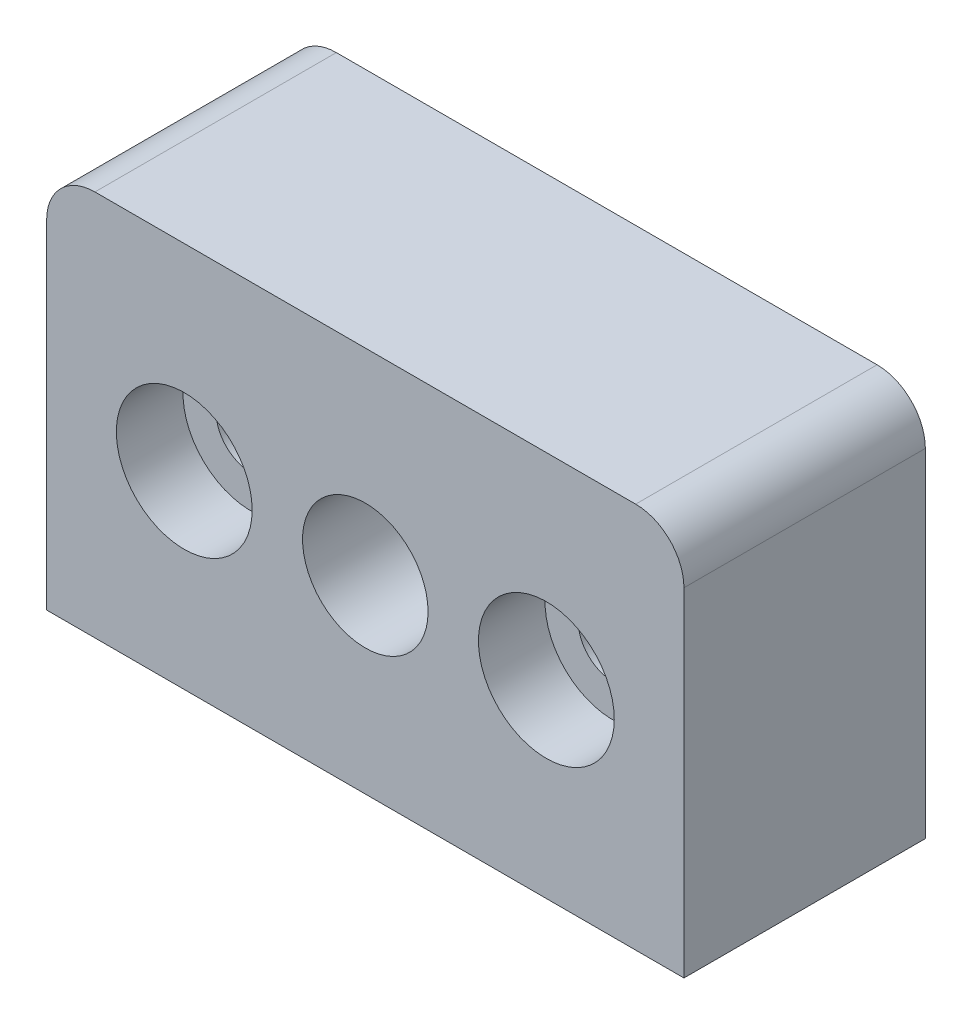
ISO-10303-21;
HEADER;
FILE_DESCRIPTION(('STEP AP214'),'2;1');
FILE_NAME('part.step','',(''),(''),'','','');
FILE_SCHEMA(('AUTOMOTIVE_DESIGN { 1 0 10303 214 1 1 1 1 }'));
ENDSEC;
DATA;
#1=APPLICATION_CONTEXT('core data for automotive mechanical design processes');
#2=APPLICATION_PROTOCOL_DEFINITION('international standard','automotive_design',2000,#1);
#3=PRODUCT_CONTEXT('',#1,'mechanical');
#4=PRODUCT('Part','Part','',(#3));
#5=PRODUCT_RELATED_PRODUCT_CATEGORY('part','',(#4));
#6=PRODUCT_DEFINITION_FORMATION('','',#4);
#7=PRODUCT_DEFINITION_CONTEXT('part definition',#1,'design');
#8=PRODUCT_DEFINITION('design','',#6,#7);
#9=PRODUCT_DEFINITION_SHAPE('','',#8);
#10=(LENGTH_UNIT() NAMED_UNIT(*) SI_UNIT(.MILLI.,.METRE.));
#11=(NAMED_UNIT(*) PLANE_ANGLE_UNIT() SI_UNIT($,.RADIAN.));
#12=(NAMED_UNIT(*) SI_UNIT($,.STERADIAN.) SOLID_ANGLE_UNIT());
#13=UNCERTAINTY_MEASURE_WITH_UNIT(LENGTH_MEASURE(1.E-05),#10,'distance_accuracy_value','');
#14=(GEOMETRIC_REPRESENTATION_CONTEXT(3) GLOBAL_UNCERTAINTY_ASSIGNED_CONTEXT((#13)) GLOBAL_UNIT_ASSIGNED_CONTEXT((#10,
#11,#12)) REPRESENTATION_CONTEXT('',''));
#15=CARTESIAN_POINT('',(0.,0.,0.));
#16=DIRECTION('',(0.,0.,1.));
#17=DIRECTION('',(1.,0.,0.));
#18=AXIS2_PLACEMENT_3D('',#15,#16,#17);
#19=CARTESIAN_POINT('',(0.,0.,12.7));
#20=DIRECTION('',(1.,0.,0.));
#21=DIRECTION('',(0.,1.,0.));
#22=AXIS2_PLACEMENT_3D('',#19,#20,#21);
#23=PLANE('',#22);
#24=DIRECTION('',(0.,-1.,0.));
#25=VECTOR('',#24,1.);
#26=CARTESIAN_POINT('',(0.,0.,12.7));
#27=LINE('',#26,#25);
#28=CARTESIAN_POINT('',(0.,17.78,12.7));
#29=VERTEX_POINT('',#28);
#30=CARTESIAN_POINT('',(0.,0.,12.7));
#31=VERTEX_POINT('',#30);
#32=EDGE_CURVE('E145',#29,#31,#27,.T.);
#33=ORIENTED_EDGE('',*,*,#32,.F.);
#34=DIRECTION('',(0.,0.,-1.));
#35=VECTOR('',#34,1.);
#36=CARTESIAN_POINT('',(0.,17.78,12.7));
#37=LINE('',#36,#35);
#38=CARTESIAN_POINT('',(0.,17.78,0.));
#39=VERTEX_POINT('',#38);
#40=EDGE_CURVE('E166',#29,#39,#37,.T.);
#41=ORIENTED_EDGE('',*,*,#40,.T.);
#42=DIRECTION('',(0.,-1.,0.));
#43=VECTOR('',#42,1.);
#44=CARTESIAN_POINT('',(0.,0.,0.));
#45=LINE('',#44,#43);
#46=CARTESIAN_POINT('',(0.,0.,0.));
#47=VERTEX_POINT('',#46);
#48=EDGE_CURVE('E142',#39,#47,#45,.T.);
#49=ORIENTED_EDGE('',*,*,#48,.T.);
#50=DIRECTION('',(0.,0.,-1.));
#51=VECTOR('',#50,1.);
#52=CARTESIAN_POINT('',(0.,0.,12.7));
#53=LINE('',#52,#51);
#54=EDGE_CURVE('E163',#31,#47,#53,.T.);
#55=ORIENTED_EDGE('',*,*,#54,.F.);
#56=EDGE_LOOP('',(#33,#41,#49,#55));
#57=FACE_BOUND('',#56,.T.);
#58=ADVANCED_FACE('F34',(#57),#23,.F.);
#59=CARTESIAN_POINT('',(0.,0.,12.7));
#60=DIRECTION('',(0.,1.,0.));
#61=DIRECTION('',(0.,0.,1.));
#62=AXIS2_PLACEMENT_3D('',#59,#60,#61);
#63=PLANE('',#62);
#64=CARTESIAN_POINT('',(11.43,0.,6.35));
#65=DIRECTION('',(0.,-1.,0.));
#66=DIRECTION('',(0.,0.,-1.));
#67=AXIS2_PLACEMENT_3D('',#64,#65,#66);
#68=CIRCLE('',#67,1.35254999999999);
#69=CARTESIAN_POINT('',(11.43,0.,4.99745000000001));
#70=VERTEX_POINT('',#69);
#71=EDGE_CURVE('E104',#70,#70,#68,.T.);
#72=ORIENTED_EDGE('',*,*,#71,.F.);
#73=EDGE_LOOP('',(#72));
#74=FACE_BOUND('',#73,.T.);
#75=CARTESIAN_POINT('',(22.098,0.,6.35));
#76=DIRECTION('',(0.,-1.,0.));
#77=DIRECTION('',(0.,0.,-1.));
#78=AXIS2_PLACEMENT_3D('',#75,#76,#77);
#79=CIRCLE('',#78,1.35254999999999);
#80=CARTESIAN_POINT('',(22.098,0.,4.99745000000001));
#81=VERTEX_POINT('',#80);
#82=EDGE_CURVE('E103',#81,#81,#79,.T.);
#83=ORIENTED_EDGE('',*,*,#82,.F.);
#84=EDGE_LOOP('',(#83));
#85=FACE_BOUND('',#84,.T.);
#86=DIRECTION('',(1.,0.,0.));
#87=VECTOR('',#86,1.);
#88=CARTESIAN_POINT('',(0.,0.,0.));
#89=LINE('',#88,#87);
#90=CARTESIAN_POINT('',(33.528,0.,0.));
#91=VERTEX_POINT('',#90);
#92=EDGE_CURVE('E156',#47,#91,#89,.T.);
#93=ORIENTED_EDGE('',*,*,#92,.T.);
#94=DIRECTION('',(0.,0.,-1.));
#95=VECTOR('',#94,1.);
#96=CARTESIAN_POINT('',(33.528,0.,12.7));
#97=LINE('',#96,#95);
#98=CARTESIAN_POINT('',(33.528,0.,12.7));
#99=VERTEX_POINT('',#98);
#100=EDGE_CURVE('E154',#99,#91,#97,.T.);
#101=ORIENTED_EDGE('',*,*,#100,.F.);
#102=DIRECTION('',(1.,0.,0.));
#103=VECTOR('',#102,1.);
#104=CARTESIAN_POINT('',(0.,0.,12.7));
#105=LINE('',#104,#103);
#106=EDGE_CURVE('E147',#31,#99,#105,.T.);
#107=ORIENTED_EDGE('',*,*,#106,.F.);
#108=ORIENTED_EDGE('',*,*,#54,.T.);
#109=EDGE_LOOP('',(#93,#101,#107,#108));
#110=FACE_BOUND('',#109,.T.);
#111=ADVANCED_FACE('F201',(#74,#85,#110),#63,.F.);
#112=CARTESIAN_POINT('',(33.528,0.,12.7));
#113=DIRECTION('',(-1.,0.,0.));
#114=DIRECTION('',(0.,-1.,0.));
#115=AXIS2_PLACEMENT_3D('',#112,#113,#114);
#116=PLANE('',#115);
#117=DIRECTION('',(0.,1.,0.));
#118=VECTOR('',#117,1.);
#119=CARTESIAN_POINT('',(33.528,0.,0.));
#120=LINE('',#119,#118);
#121=CARTESIAN_POINT('',(33.528,17.78,0.));
#122=VERTEX_POINT('',#121);
#123=EDGE_CURVE('E158',#91,#122,#120,.T.);
#124=ORIENTED_EDGE('',*,*,#123,.T.);
#125=DIRECTION('',(0.,0.,-1.));
#126=VECTOR('',#125,1.);
#127=CARTESIAN_POINT('',(33.528,17.78,12.7));
#128=LINE('',#127,#126);
#129=CARTESIAN_POINT('',(33.528,17.78,12.7));
#130=VERTEX_POINT('',#129);
#131=EDGE_CURVE('E11',#122,#130,#128,.F.);
#132=ORIENTED_EDGE('',*,*,#131,.T.);
#133=DIRECTION('',(0.,1.,0.));
#134=VECTOR('',#133,1.);
#135=CARTESIAN_POINT('',(33.528,0.,12.7));
#136=LINE('',#135,#134);
#137=EDGE_CURVE('E150',#99,#130,#136,.T.);
#138=ORIENTED_EDGE('',*,*,#137,.F.);
#139=ORIENTED_EDGE('',*,*,#100,.T.);
#140=EDGE_LOOP('',(#124,#132,#138,#139));
#141=FACE_BOUND('',#140,.T.);
#142=ADVANCED_FACE('F198',(#141),#116,.F.);
#143=CARTESIAN_POINT('',(0.,20.32,12.7));
#144=DIRECTION('',(0.,-1.,0.));
#145=DIRECTION('',(0.,0.,-1.));
#146=AXIS2_PLACEMENT_3D('',#143,#144,#145);
#147=PLANE('',#146);
#148=DIRECTION('',(-1.,0.,0.));
#149=VECTOR('',#148,1.);
#150=CARTESIAN_POINT('',(0.,20.32,0.));
#151=LINE('',#150,#149);
#152=CARTESIAN_POINT('',(30.988,20.32,0.));
#153=VERTEX_POINT('',#152);
#154=CARTESIAN_POINT('',(2.53999999999999,20.32,0.));
#155=VERTEX_POINT('',#154);
#156=EDGE_CURVE('E148',#153,#155,#151,.T.);
#157=ORIENTED_EDGE('',*,*,#156,.T.);
#158=DIRECTION('',(0.,0.,-1.));
#159=VECTOR('',#158,1.);
#160=CARTESIAN_POINT('',(2.53999999999999,20.32,12.7));
#161=LINE('',#160,#159);
#162=CARTESIAN_POINT('',(2.53999999999999,20.32,12.7));
#163=VERTEX_POINT('',#162);
#164=EDGE_CURVE('E55',#155,#163,#161,.F.);
#165=ORIENTED_EDGE('',*,*,#164,.T.);
#166=DIRECTION('',(-1.,0.,0.));
#167=VECTOR('',#166,1.);
#168=CARTESIAN_POINT('',(0.,20.32,12.7));
#169=LINE('',#168,#167);
#170=CARTESIAN_POINT('',(30.988,20.32,12.7));
#171=VERTEX_POINT('',#170);
#172=EDGE_CURVE('E152',#171,#163,#169,.T.);
#173=ORIENTED_EDGE('',*,*,#172,.F.);
#174=DIRECTION('',(0.,0.,-1.));
#175=VECTOR('',#174,1.);
#176=CARTESIAN_POINT('',(30.988,20.32,12.7));
#177=LINE('',#176,#175);
#178=EDGE_CURVE('E173',#171,#153,#177,.T.);
#179=ORIENTED_EDGE('',*,*,#178,.T.);
#180=EDGE_LOOP('',(#157,#165,#173,#179));
#181=FACE_BOUND('',#180,.T.);
#182=ADVANCED_FACE('F193',(#181),#147,.F.);
#183=CARTESIAN_POINT('',(0.,0.,12.7));
#184=DIRECTION('',(0.,0.,-1.));
#185=DIRECTION('',(-1.,0.,0.));
#186=AXIS2_PLACEMENT_3D('',#183,#184,#185);
#187=PLANE('',#186);
#188=CARTESIAN_POINT('',(7.23899999999999,9.9568,12.7));
#189=DIRECTION('',(0.,0.,1.));
#190=DIRECTION('',(1.,0.,0.));
#191=AXIS2_PLACEMENT_3D('',#188,#189,#190);
#192=CIRCLE('',#191,3.57251);
#193=CARTESIAN_POINT('',(10.81151,9.9568,12.7));
#194=VERTEX_POINT('',#193);
#195=EDGE_CURVE('E114',#194,#194,#192,.T.);
#196=ORIENTED_EDGE('',*,*,#195,.F.);
#197=EDGE_LOOP('',(#196));
#198=FACE_BOUND('',#197,.T.);
#199=CARTESIAN_POINT('',(26.289,9.9568,12.7));
#200=DIRECTION('',(0.,0.,1.));
#201=DIRECTION('',(1.,0.,0.));
#202=AXIS2_PLACEMENT_3D('',#199,#200,#201);
#203=CIRCLE('',#202,3.57251);
#204=CARTESIAN_POINT('',(29.86151,9.9568,12.7));
#205=VERTEX_POINT('',#204);
#206=EDGE_CURVE('E126',#205,#205,#203,.T.);
#207=ORIENTED_EDGE('',*,*,#206,.F.);
#208=EDGE_LOOP('',(#207));
#209=FACE_BOUND('',#208,.T.);
#210=CARTESIAN_POINT('',(16.764,9.9568,12.7));
#211=DIRECTION('',(0.,0.,1.));
#212=DIRECTION('',(1.,0.,0.));
#213=AXIS2_PLACEMENT_3D('',#210,#211,#212);
#214=CIRCLE('',#213,3.302);
#215=CARTESIAN_POINT('',(20.066,9.9568,12.7));
#216=VERTEX_POINT('',#215);
#217=EDGE_CURVE('E138',#216,#216,#214,.T.);
#218=ORIENTED_EDGE('',*,*,#217,.F.);
#219=EDGE_LOOP('',(#218));
#220=FACE_BOUND('',#219,.T.);
#221=ORIENTED_EDGE('',*,*,#172,.T.);
#222=CARTESIAN_POINT('',(2.53999999999999,17.78,12.7));
#223=DIRECTION('',(0.,0.,-1.));
#224=DIRECTION('',(-1.,0.,0.));
#225=AXIS2_PLACEMENT_3D('',#222,#223,#224);
#226=CIRCLE('',#225,2.54);
#227=EDGE_CURVE('E42',#163,#29,#226,.F.);
#228=ORIENTED_EDGE('',*,*,#227,.T.);
#229=ORIENTED_EDGE('',*,*,#32,.T.);
#230=ORIENTED_EDGE('',*,*,#106,.T.);
#231=ORIENTED_EDGE('',*,*,#137,.T.);
#232=CARTESIAN_POINT('',(30.988,17.78,12.7));
#233=DIRECTION('',(0.,0.,-1.));
#234=DIRECTION('',(-1.,0.,0.));
#235=AXIS2_PLACEMENT_3D('',#232,#233,#234);
#236=CIRCLE('',#235,2.54);
#237=EDGE_CURVE('E177',#130,#171,#236,.F.);
#238=ORIENTED_EDGE('',*,*,#237,.T.);
#239=EDGE_LOOP('',(#221,#228,#229,#230,#231,#238));
#240=FACE_BOUND('',#239,.T.);
#241=ADVANCED_FACE('F181',(#198,#209,#220,#240),#187,.F.);
#242=CARTESIAN_POINT('',(0.,0.,0.));
#243=DIRECTION('',(0.,0.,-1.));
#244=DIRECTION('',(-1.,0.,0.));
#245=AXIS2_PLACEMENT_3D('',#242,#243,#244);
#246=PLANE('',#245);
#247=CARTESIAN_POINT('',(7.23899999999999,9.9568,0.));
#248=DIRECTION('',(0.,0.,1.));
#249=DIRECTION('',(1.,0.,0.));
#250=AXIS2_PLACEMENT_3D('',#247,#248,#249);
#251=CIRCLE('',#250,1.8288);
#252=CARTESIAN_POINT('',(9.06779999999999,9.9568,0.));
#253=VERTEX_POINT('',#252);
#254=EDGE_CURVE('E123',#253,#253,#251,.T.);
#255=ORIENTED_EDGE('',*,*,#254,.T.);
#256=EDGE_LOOP('',(#255));
#257=FACE_BOUND('',#256,.T.);
#258=CARTESIAN_POINT('',(26.289,9.9568,0.));
#259=DIRECTION('',(0.,0.,1.));
#260=DIRECTION('',(1.,0.,0.));
#261=AXIS2_PLACEMENT_3D('',#258,#259,#260);
#262=CIRCLE('',#261,1.8288);
#263=CARTESIAN_POINT('',(28.1178,9.9568,0.));
#264=VERTEX_POINT('',#263);
#265=EDGE_CURVE('E135',#264,#264,#262,.T.);
#266=ORIENTED_EDGE('',*,*,#265,.T.);
#267=EDGE_LOOP('',(#266));
#268=FACE_BOUND('',#267,.T.);
#269=CARTESIAN_POINT('',(16.764,9.9568,0.));
#270=DIRECTION('',(0.,0.,1.));
#271=DIRECTION('',(1.,0.,0.));
#272=AXIS2_PLACEMENT_3D('',#269,#270,#271);
#273=CIRCLE('',#272,3.302);
#274=CARTESIAN_POINT('',(20.066,9.9568,0.));
#275=VERTEX_POINT('',#274);
#276=EDGE_CURVE('E139',#275,#275,#273,.T.);
#277=ORIENTED_EDGE('',*,*,#276,.T.);
#278=EDGE_LOOP('',(#277));
#279=FACE_BOUND('',#278,.T.);
#280=ORIENTED_EDGE('',*,*,#48,.F.);
#281=CARTESIAN_POINT('',(2.53999999999999,17.78,0.));
#282=DIRECTION('',(0.,0.,-1.));
#283=DIRECTION('',(-1.,0.,0.));
#284=AXIS2_PLACEMENT_3D('',#281,#282,#283);
#285=CIRCLE('',#284,2.54);
#286=EDGE_CURVE('E171',#39,#155,#285,.T.);
#287=ORIENTED_EDGE('',*,*,#286,.T.);
#288=ORIENTED_EDGE('',*,*,#156,.F.);
#289=CARTESIAN_POINT('',(30.988,17.78,0.));
#290=DIRECTION('',(0.,0.,-1.));
#291=DIRECTION('',(-1.,0.,0.));
#292=AXIS2_PLACEMENT_3D('',#289,#290,#291);
#293=CIRCLE('',#292,2.54);
#294=EDGE_CURVE('E169',#153,#122,#293,.T.);
#295=ORIENTED_EDGE('',*,*,#294,.T.);
#296=ORIENTED_EDGE('',*,*,#123,.F.);
#297=ORIENTED_EDGE('',*,*,#92,.F.);
#298=EDGE_LOOP('',(#280,#287,#288,#295,#296,#297));
#299=FACE_BOUND('',#298,.T.);
#300=ADVANCED_FACE('F191',(#257,#268,#279,#299),#246,.T.);
#301=CARTESIAN_POINT('',(16.764,9.9568,0.));
#302=DIRECTION('',(0.,0.,1.));
#303=DIRECTION('',(1.,0.,0.));
#304=AXIS2_PLACEMENT_3D('',#301,#302,#303);
#305=CYLINDRICAL_SURFACE('',#304,3.302);
#306=ORIENTED_EDGE('',*,*,#276,.F.);
#307=EDGE_LOOP('',(#306));
#308=FACE_BOUND('',#307,.T.);
#309=ORIENTED_EDGE('',*,*,#217,.T.);
#310=EDGE_LOOP('',(#309));
#311=FACE_BOUND('',#310,.T.);
#312=ADVANCED_FACE('F250',(#308,#311),#305,.F.);
#313=CARTESIAN_POINT('',(26.289,9.9568,12.7));
#314=DIRECTION('',(0.,0.,1.));
#315=DIRECTION('',(1.,0.,0.));
#316=AXIS2_PLACEMENT_3D('',#313,#314,#315);
#317=CYLINDRICAL_SURFACE('',#316,1.8288);
#318=ORIENTED_EDGE('',*,*,#265,.F.);
#319=EDGE_LOOP('',(#318));
#320=FACE_BOUND('',#319,.T.);
#321=CARTESIAN_POINT('',(26.289,9.9568,9.1948));
#322=DIRECTION('',(0.,0.,1.));
#323=DIRECTION('',(1.,0.,0.));
#324=AXIS2_PLACEMENT_3D('',#321,#322,#323);
#325=CIRCLE('',#324,1.8288);
#326=CARTESIAN_POINT('',(28.1178,9.9568,9.1948));
#327=VERTEX_POINT('',#326);
#328=EDGE_CURVE('E132',#327,#327,#325,.T.);
#329=ORIENTED_EDGE('',*,*,#328,.T.);
#330=EDGE_LOOP('',(#329));
#331=FACE_BOUND('',#330,.T.);
#332=ADVANCED_FACE('F246',(#320,#331),#317,.F.);
#333=CARTESIAN_POINT('',(28.1178,9.9568,9.1948));
#334=DIRECTION('',(0.,0.,-1.));
#335=DIRECTION('',(-1.,0.,0.));
#336=AXIS2_PLACEMENT_3D('',#333,#334,#335);
#337=PLANE('',#336);
#338=ORIENTED_EDGE('',*,*,#328,.F.);
#339=EDGE_LOOP('',(#338));
#340=FACE_BOUND('',#339,.T.);
#341=CARTESIAN_POINT('',(26.289,9.9568,9.1948));
#342=DIRECTION('',(0.,0.,1.));
#343=DIRECTION('',(1.,0.,0.));
#344=AXIS2_PLACEMENT_3D('',#341,#342,#343);
#345=CIRCLE('',#344,3.57251);
#346=CARTESIAN_POINT('',(29.86151,9.9568,9.1948));
#347=VERTEX_POINT('',#346);
#348=EDGE_CURVE('E129',#347,#347,#345,.T.);
#349=ORIENTED_EDGE('',*,*,#348,.T.);
#350=EDGE_LOOP('',(#349));
#351=FACE_BOUND('',#350,.T.);
#352=ADVANCED_FACE('F242',(#340,#351),#337,.F.);
#353=CARTESIAN_POINT('',(26.289,9.9568,12.7));
#354=DIRECTION('',(0.,0.,1.));
#355=DIRECTION('',(1.,0.,0.));
#356=AXIS2_PLACEMENT_3D('',#353,#354,#355);
#357=CYLINDRICAL_SURFACE('',#356,3.57251);
#358=ORIENTED_EDGE('',*,*,#348,.F.);
#359=EDGE_LOOP('',(#358));
#360=FACE_BOUND('',#359,.T.);
#361=ORIENTED_EDGE('',*,*,#206,.T.);
#362=EDGE_LOOP('',(#361));
#363=FACE_BOUND('',#362,.T.);
#364=ADVANCED_FACE('F238',(#360,#363),#357,.F.);
#365=CARTESIAN_POINT('',(7.23899999999999,9.9568,12.7));
#366=DIRECTION('',(0.,0.,1.));
#367=DIRECTION('',(1.,0.,0.));
#368=AXIS2_PLACEMENT_3D('',#365,#366,#367);
#369=CYLINDRICAL_SURFACE('',#368,1.8288);
#370=ORIENTED_EDGE('',*,*,#254,.F.);
#371=EDGE_LOOP('',(#370));
#372=FACE_BOUND('',#371,.T.);
#373=CARTESIAN_POINT('',(7.23899999999999,9.9568,9.1948));
#374=DIRECTION('',(0.,0.,1.));
#375=DIRECTION('',(1.,0.,0.));
#376=AXIS2_PLACEMENT_3D('',#373,#374,#375);
#377=CIRCLE('',#376,1.8288);
#378=CARTESIAN_POINT('',(9.06779999999999,9.9568,9.1948));
#379=VERTEX_POINT('',#378);
#380=EDGE_CURVE('E120',#379,#379,#377,.T.);
#381=ORIENTED_EDGE('',*,*,#380,.T.);
#382=EDGE_LOOP('',(#381));
#383=FACE_BOUND('',#382,.T.);
#384=ADVANCED_FACE('F228',(#372,#383),#369,.F.);
#385=CARTESIAN_POINT('',(9.06779999999999,9.9568,9.1948));
#386=DIRECTION('',(0.,0.,-1.));
#387=DIRECTION('',(-1.,0.,0.));
#388=AXIS2_PLACEMENT_3D('',#385,#386,#387);
#389=PLANE('',#388);
#390=ORIENTED_EDGE('',*,*,#380,.F.);
#391=EDGE_LOOP('',(#390));
#392=FACE_BOUND('',#391,.T.);
#393=CARTESIAN_POINT('',(7.23899999999999,9.9568,9.1948));
#394=DIRECTION('',(0.,0.,1.));
#395=DIRECTION('',(1.,0.,0.));
#396=AXIS2_PLACEMENT_3D('',#393,#394,#395);
#397=CIRCLE('',#396,3.57251);
#398=CARTESIAN_POINT('',(10.81151,9.9568,9.1948));
#399=VERTEX_POINT('',#398);
#400=EDGE_CURVE('E117',#399,#399,#397,.T.);
#401=ORIENTED_EDGE('',*,*,#400,.T.);
#402=EDGE_LOOP('',(#401));
#403=FACE_BOUND('',#402,.T.);
#404=ADVANCED_FACE('F222',(#392,#403),#389,.F.);
#405=CARTESIAN_POINT('',(7.23899999999999,9.9568,12.7));
#406=DIRECTION('',(0.,0.,1.));
#407=DIRECTION('',(1.,0.,0.));
#408=AXIS2_PLACEMENT_3D('',#405,#406,#407);
#409=CYLINDRICAL_SURFACE('',#408,3.57251);
#410=ORIENTED_EDGE('',*,*,#400,.F.);
#411=EDGE_LOOP('',(#410));
#412=FACE_BOUND('',#411,.T.);
#413=ORIENTED_EDGE('',*,*,#195,.T.);
#414=EDGE_LOOP('',(#413));
#415=FACE_BOUND('',#414,.T.);
#416=ADVANCED_FACE('F216',(#412,#415),#409,.F.);
#417=CARTESIAN_POINT('',(2.53999999999999,17.78,12.7));
#418=DIRECTION('',(0.,0.,-1.));
#419=DIRECTION('',(-1.,0.,0.));
#420=AXIS2_PLACEMENT_3D('',#417,#418,#419);
#421=CYLINDRICAL_SURFACE('',#420,2.54);
#422=ORIENTED_EDGE('',*,*,#227,.F.);
#423=ORIENTED_EDGE('',*,*,#164,.F.);
#424=ORIENTED_EDGE('',*,*,#286,.F.);
#425=ORIENTED_EDGE('',*,*,#40,.F.);
#426=EDGE_LOOP('',(#422,#423,#424,#425));
#427=FACE_BOUND('',#426,.T.);
#428=ADVANCED_FACE('F188',(#427),#421,.T.);
#429=CARTESIAN_POINT('',(30.988,17.78,12.7));
#430=DIRECTION('',(0.,0.,-1.));
#431=DIRECTION('',(-1.,0.,0.));
#432=AXIS2_PLACEMENT_3D('',#429,#430,#431);
#433=CYLINDRICAL_SURFACE('',#432,2.54);
#434=ORIENTED_EDGE('',*,*,#237,.F.);
#435=ORIENTED_EDGE('',*,*,#131,.F.);
#436=ORIENTED_EDGE('',*,*,#294,.F.);
#437=ORIENTED_EDGE('',*,*,#178,.F.);
#438=EDGE_LOOP('',(#434,#435,#436,#437));
#439=FACE_BOUND('',#438,.T.);
#440=ADVANCED_FACE('F36',(#439),#433,.T.);
#441=CARTESIAN_POINT('',(22.098,7.62,6.35));
#442=DIRECTION('',(0.,-1.,0.));
#443=DIRECTION('',(0.,0.,-1.));
#444=AXIS2_PLACEMENT_3D('',#441,#442,#443);
#445=CONICAL_SURFACE('',#444,1.35255,1.02974425867665);
#446=CARTESIAN_POINT('',(22.098,8.43269403026573,6.35));
#447=VERTEX_POINT('',#446);
#448=VERTEX_LOOP('',#447);
#449=FACE_BOUND('',#448,.T.);
#450=CARTESIAN_POINT('',(22.098,7.62,6.35));
#451=DIRECTION('',(0.,-1.,0.));
#452=DIRECTION('',(0.,0.,-1.));
#453=AXIS2_PLACEMENT_3D('',#450,#451,#452);
#454=CIRCLE('',#453,1.35255);
#455=CARTESIAN_POINT('',(22.098,7.62,4.99745000000001));
#456=VERTEX_POINT('',#455);
#457=EDGE_CURVE('E107',#456,#456,#454,.T.);
#458=ORIENTED_EDGE('',*,*,#457,.T.);
#459=EDGE_LOOP('',(#458));
#460=FACE_BOUND('',#459,.T.);
#461=ADVANCED_FACE('F221',(#449,#460),#445,.F.);
#462=CARTESIAN_POINT('',(22.098,0.,6.35));
#463=DIRECTION('',(0.,-1.,0.));
#464=DIRECTION('',(0.,0.,-1.));
#465=AXIS2_PLACEMENT_3D('',#462,#463,#464);
#466=CYLINDRICAL_SURFACE('',#465,1.35254999999999);
#467=ORIENTED_EDGE('',*,*,#457,.F.);
#468=EDGE_LOOP('',(#467));
#469=FACE_BOUND('',#468,.T.);
#470=ORIENTED_EDGE('',*,*,#82,.T.);
#471=EDGE_LOOP('',(#470));
#472=FACE_BOUND('',#471,.T.);
#473=ADVANCED_FACE('F97',(#469,#472),#466,.F.);
#474=CARTESIAN_POINT('',(11.43,7.62,6.35));
#475=DIRECTION('',(0.,-1.,0.));
#476=DIRECTION('',(0.,0.,-1.));
#477=AXIS2_PLACEMENT_3D('',#474,#475,#476);
#478=CONICAL_SURFACE('',#477,1.35255,1.02974425867665);
#479=CARTESIAN_POINT('',(11.43,8.43269403026573,6.35));
#480=VERTEX_POINT('',#479);
#481=VERTEX_LOOP('',#480);
#482=FACE_BOUND('',#481,.T.);
#483=CARTESIAN_POINT('',(11.43,7.62,6.35));
#484=DIRECTION('',(0.,-1.,0.));
#485=DIRECTION('',(0.,0.,-1.));
#486=AXIS2_PLACEMENT_3D('',#483,#484,#485);
#487=CIRCLE('',#486,1.35255);
#488=CARTESIAN_POINT('',(11.43,7.62,4.99745));
#489=VERTEX_POINT('',#488);
#490=EDGE_CURVE('E101',#489,#489,#487,.T.);
#491=ORIENTED_EDGE('',*,*,#490,.T.);
#492=EDGE_LOOP('',(#491));
#493=FACE_BOUND('',#492,.T.);
#494=ADVANCED_FACE('F93',(#482,#493),#478,.F.);
#495=CARTESIAN_POINT('',(11.43,0.,6.35));
#496=DIRECTION('',(0.,-1.,0.));
#497=DIRECTION('',(0.,0.,-1.));
#498=AXIS2_PLACEMENT_3D('',#495,#496,#497);
#499=CYLINDRICAL_SURFACE('',#498,1.35254999999999);
#500=ORIENTED_EDGE('',*,*,#490,.F.);
#501=EDGE_LOOP('',(#500));
#502=FACE_BOUND('',#501,.T.);
#503=ORIENTED_EDGE('',*,*,#71,.T.);
#504=EDGE_LOOP('',(#503));
#505=FACE_BOUND('',#504,.T.);
#506=ADVANCED_FACE('F96',(#502,#505),#499,.F.);
#507=CLOSED_SHELL('',(#58,#111,#142,#182,#241,#300,#312,#332,#352,#364,#384,#404,#416,#428,#440,
#461,#473,#494,#506));
#508=MANIFOLD_SOLID_BREP('B2',#507);
#509=ADVANCED_BREP_SHAPE_REPRESENTATION('',(#18,#508),#14);
#510=SHAPE_DEFINITION_REPRESENTATION(#9,#509);
ENDSEC;
END-ISO-10303-21;
